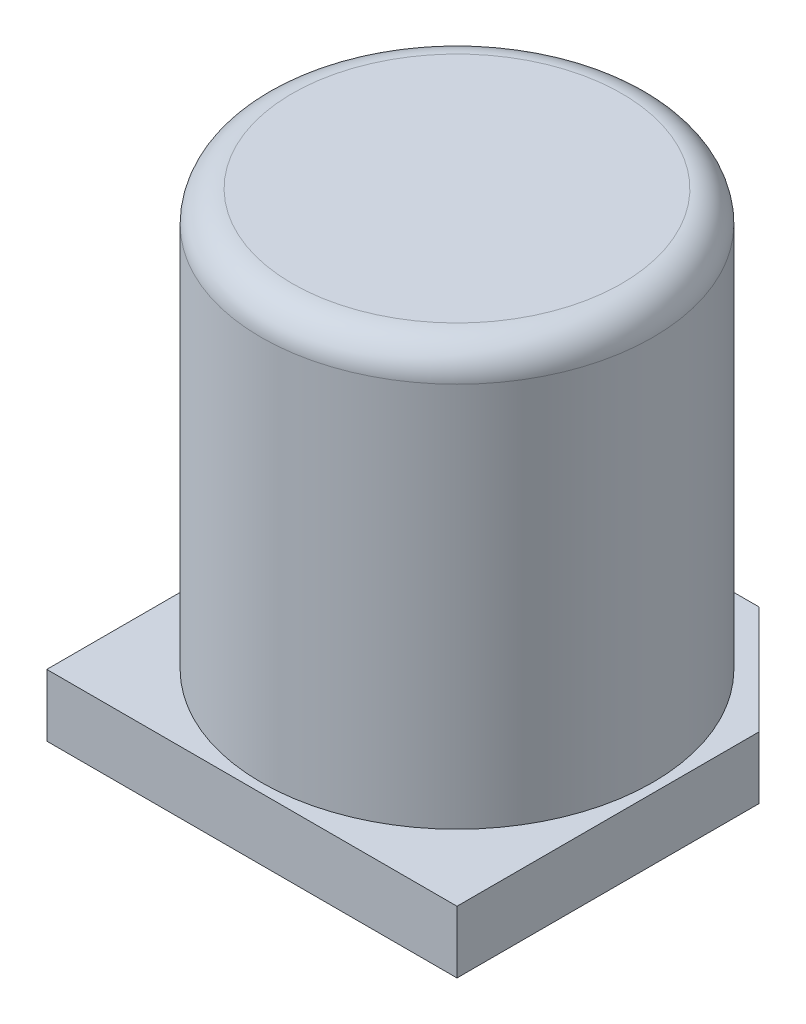
ISO-10303-21;
HEADER;
FILE_DESCRIPTION(('STEP AP214'),'2;1');
FILE_NAME('part.step','',(''),(''),'','','');
FILE_SCHEMA(('AUTOMOTIVE_DESIGN { 1 0 10303 214 1 1 1 1 }'));
ENDSEC;
DATA;
#1=APPLICATION_CONTEXT('core data for automotive mechanical design processes');
#2=APPLICATION_PROTOCOL_DEFINITION('international standard','automotive_design',2000,#1);
#3=PRODUCT_CONTEXT('',#1,'mechanical');
#4=PRODUCT('Part','Part','',(#3));
#5=PRODUCT_RELATED_PRODUCT_CATEGORY('part','',(#4));
#6=PRODUCT_DEFINITION_FORMATION('','',#4);
#7=PRODUCT_DEFINITION_CONTEXT('part definition',#1,'design');
#8=PRODUCT_DEFINITION('design','',#6,#7);
#9=PRODUCT_DEFINITION_SHAPE('','',#8);
#10=(LENGTH_UNIT() NAMED_UNIT(*) SI_UNIT(.MILLI.,.METRE.));
#11=(NAMED_UNIT(*) PLANE_ANGLE_UNIT() SI_UNIT($,.RADIAN.));
#12=(NAMED_UNIT(*) SI_UNIT($,.STERADIAN.) SOLID_ANGLE_UNIT());
#13=UNCERTAINTY_MEASURE_WITH_UNIT(LENGTH_MEASURE(1.E-05),#10,'distance_accuracy_value','');
#14=(GEOMETRIC_REPRESENTATION_CONTEXT(3) GLOBAL_UNCERTAINTY_ASSIGNED_CONTEXT((#13)) GLOBAL_UNIT_ASSIGNED_CONTEXT((#10,
#11,#12)) REPRESENTATION_CONTEXT('',''));
#15=CARTESIAN_POINT('',(0.,0.,0.));
#16=DIRECTION('',(0.,0.,1.));
#17=DIRECTION('',(1.,0.,0.));
#18=AXIS2_PLACEMENT_3D('',#15,#16,#17);
#19=CARTESIAN_POINT('',(-7.40142135623731,1.,0.));
#20=DIRECTION('',(0.,1.,0.));
#21=DIRECTION('',(0.,0.,1.));
#22=AXIS2_PLACEMENT_3D('',#19,#20,#21);
#23=PLANE('',#22);
#24=DIRECTION('',(0.,0.,1.));
#25=VECTOR('',#24,1.);
#26=CARTESIAN_POINT('',(3.3,1.,0.));
#27=LINE('',#26,#25);
#28=CARTESIAN_POINT('',(3.3,1.,-1.56254826892681));
#29=VERTEX_POINT('',#28);
#30=CARTESIAN_POINT('',(3.3,1.,3.3));
#31=VERTEX_POINT('',#30);
#32=EDGE_CURVE('E135',#29,#31,#27,.T.);
#33=ORIENTED_EDGE('',*,*,#32,.F.);
#34=DIRECTION('',(-0.707106781186547,0.,-0.707106781186549));
#35=VECTOR('',#34,1.);
#36=CARTESIAN_POINT('',(-1.26943654365524,1.,-6.13198481258206));
#37=LINE('',#36,#35);
#38=CARTESIAN_POINT('',(1.56254826892681,1.,-3.3));
#39=VERTEX_POINT('',#38);
#40=EDGE_CURVE('E116',#29,#39,#37,.T.);
#41=ORIENTED_EDGE('',*,*,#40,.T.);
#42=DIRECTION('',(1.,0.,0.));
#43=VECTOR('',#42,1.);
#44=CARTESIAN_POINT('',(-7.40142135623731,1.,-3.3));
#45=LINE('',#44,#43);
#46=CARTESIAN_POINT('',(-1.56254826892681,1.,-3.3));
#47=VERTEX_POINT('',#46);
#48=EDGE_CURVE('E114',#47,#39,#45,.T.);
#49=ORIENTED_EDGE('',*,*,#48,.F.);
#50=DIRECTION('',(0.707106781186546,0.,-0.707106781186549));
#51=VECTOR('',#50,1.);
#52=CARTESIAN_POINT('',(-6.13198481258205,1.,1.26943654365525));
#53=LINE('',#52,#51);
#54=CARTESIAN_POINT('',(-3.3,1.,-1.56254826892681));
#55=VERTEX_POINT('',#54);
#56=EDGE_CURVE('E102',#55,#47,#53,.T.);
#57=ORIENTED_EDGE('',*,*,#56,.F.);
#58=DIRECTION('',(0.,0.,1.));
#59=VECTOR('',#58,1.);
#60=CARTESIAN_POINT('',(-3.3,1.,0.));
#61=LINE('',#60,#59);
#62=CARTESIAN_POINT('',(-3.3,1.,3.3));
#63=VERTEX_POINT('',#62);
#64=EDGE_CURVE('E108',#55,#63,#61,.T.);
#65=ORIENTED_EDGE('',*,*,#64,.T.);
#66=DIRECTION('',(1.,0.,0.));
#67=VECTOR('',#66,1.);
#68=CARTESIAN_POINT('',(-7.40142135623731,1.,3.3));
#69=LINE('',#68,#67);
#70=EDGE_CURVE('E53',#63,#31,#69,.T.);
#71=ORIENTED_EDGE('',*,*,#70,.T.);
#72=EDGE_LOOP('',(#33,#41,#49,#57,#65,#71));
#73=FACE_BOUND('',#72,.T.);
#74=CARTESIAN_POINT('',(0.,1.,0.));
#75=DIRECTION('',(0.,1.,0.));
#76=DIRECTION('',(0.,0.,1.));
#77=AXIS2_PLACEMENT_3D('',#74,#75,#76);
#78=CIRCLE('',#77,3.15);
#79=CARTESIAN_POINT('',(0.,1.,3.15));
#80=VERTEX_POINT('',#79);
#81=EDGE_CURVE('E125',#80,#80,#78,.T.);
#82=ORIENTED_EDGE('',*,*,#81,.F.);
#83=EDGE_LOOP('',(#82));
#84=FACE_BOUND('',#83,.T.);
#85=ADVANCED_FACE('F36',(#73,#84),#23,.T.);
#86=CARTESIAN_POINT('',(3.3,1.,0.));
#87=DIRECTION('',(1.,0.,0.));
#88=DIRECTION('',(0.,0.,-1.));
#89=AXIS2_PLACEMENT_3D('',#86,#87,#88);
#90=PLANE('',#89);
#91=DIRECTION('',(0.,0.,1.));
#92=VECTOR('',#91,1.);
#93=CARTESIAN_POINT('',(3.3,0.,0.));
#94=LINE('',#93,#92);
#95=CARTESIAN_POINT('',(3.3,0.,-1.56254826892681));
#96=VERTEX_POINT('',#95);
#97=CARTESIAN_POINT('',(3.3,0.,3.3));
#98=VERTEX_POINT('',#97);
#99=EDGE_CURVE('E121',#96,#98,#94,.T.);
#100=ORIENTED_EDGE('',*,*,#99,.F.);
#101=DIRECTION('',(0.,-1.,0.));
#102=VECTOR('',#101,1.);
#103=CARTESIAN_POINT('',(3.3,1.,-1.56254826892681));
#104=LINE('',#103,#102);
#105=EDGE_CURVE('E87',#29,#96,#104,.T.);
#106=ORIENTED_EDGE('',*,*,#105,.F.);
#107=ORIENTED_EDGE('',*,*,#32,.T.);
#108=DIRECTION('',(0.,-1.,0.));
#109=VECTOR('',#108,1.);
#110=CARTESIAN_POINT('',(3.3,1.,3.3));
#111=LINE('',#110,#109);
#112=EDGE_CURVE('E82',#31,#98,#111,.T.);
#113=ORIENTED_EDGE('',*,*,#112,.T.);
#114=EDGE_LOOP('',(#100,#106,#107,#113));
#115=FACE_BOUND('',#114,.T.);
#116=ADVANCED_FACE('F155',(#115),#90,.T.);
#117=CARTESIAN_POINT('',(-1.26943654365524,1.,-6.13198481258206));
#118=DIRECTION('',(-0.707106781186549,0.,0.707106781186547));
#119=DIRECTION('',(0.707106781186547,0.,0.707106781186549));
#120=AXIS2_PLACEMENT_3D('',#117,#118,#119);
#121=PLANE('',#120);
#122=DIRECTION('',(-0.707106781186547,0.,-0.707106781186549));
#123=VECTOR('',#122,1.);
#124=CARTESIAN_POINT('',(-1.26943654365524,0.,-6.13198481258206));
#125=LINE('',#124,#123);
#126=CARTESIAN_POINT('',(1.56254826892681,0.,-3.3));
#127=VERTEX_POINT('',#126);
#128=EDGE_CURVE('E124',#96,#127,#125,.T.);
#129=ORIENTED_EDGE('',*,*,#128,.T.);
#130=DIRECTION('',(0.,-1.,0.));
#131=VECTOR('',#130,1.);
#132=CARTESIAN_POINT('',(1.56254826892681,1.,-3.3));
#133=LINE('',#132,#131);
#134=EDGE_CURVE('E139',#39,#127,#133,.T.);
#135=ORIENTED_EDGE('',*,*,#134,.F.);
#136=ORIENTED_EDGE('',*,*,#40,.F.);
#137=ORIENTED_EDGE('',*,*,#105,.T.);
#138=EDGE_LOOP('',(#129,#135,#136,#137));
#139=FACE_BOUND('',#138,.T.);
#140=ADVANCED_FACE('F160',(#139),#121,.F.);
#141=CARTESIAN_POINT('',(-7.40142135623731,1.,-3.3));
#142=DIRECTION('',(0.,0.,-1.));
#143=DIRECTION('',(-1.,0.,0.));
#144=AXIS2_PLACEMENT_3D('',#141,#142,#143);
#145=PLANE('',#144);
#146=DIRECTION('',(1.,0.,0.));
#147=VECTOR('',#146,1.);
#148=CARTESIAN_POINT('',(-7.40142135623731,0.,-3.3));
#149=LINE('',#148,#147);
#150=CARTESIAN_POINT('',(-1.56254826892681,0.,-3.3));
#151=VERTEX_POINT('',#150);
#152=EDGE_CURVE('E128',#151,#127,#149,.T.);
#153=ORIENTED_EDGE('',*,*,#152,.F.);
#154=DIRECTION('',(0.,-1.,0.));
#155=VECTOR('',#154,1.);
#156=CARTESIAN_POINT('',(-1.56254826892681,1.,-3.3));
#157=LINE('',#156,#155);
#158=EDGE_CURVE('E105',#47,#151,#157,.T.);
#159=ORIENTED_EDGE('',*,*,#158,.F.);
#160=ORIENTED_EDGE('',*,*,#48,.T.);
#161=ORIENTED_EDGE('',*,*,#134,.T.);
#162=EDGE_LOOP('',(#153,#159,#160,#161));
#163=FACE_BOUND('',#162,.T.);
#164=ADVANCED_FACE('F175',(#163),#145,.T.);
#165=CARTESIAN_POINT('',(-6.13198481258205,1.,1.26943654365525));
#166=DIRECTION('',(-0.707106781186549,0.,-0.707106781186546));
#167=DIRECTION('',(-0.707106781186546,0.,0.707106781186549));
#168=AXIS2_PLACEMENT_3D('',#165,#166,#167);
#169=PLANE('',#168);
#170=DIRECTION('',(0.707106781186546,0.,-0.707106781186549));
#171=VECTOR('',#170,1.);
#172=CARTESIAN_POINT('',(-6.13198481258205,0.,1.26943654365525));
#173=LINE('',#172,#171);
#174=CARTESIAN_POINT('',(-3.3,0.,-1.56254826892681));
#175=VERTEX_POINT('',#174);
#176=EDGE_CURVE('E104',#175,#151,#173,.T.);
#177=ORIENTED_EDGE('',*,*,#176,.F.);
#178=DIRECTION('',(0.,-1.,0.));
#179=VECTOR('',#178,1.);
#180=CARTESIAN_POINT('',(-3.3,1.,-1.56254826892681));
#181=LINE('',#180,#179);
#182=EDGE_CURVE('E98',#55,#175,#181,.T.);
#183=ORIENTED_EDGE('',*,*,#182,.F.);
#184=ORIENTED_EDGE('',*,*,#56,.T.);
#185=ORIENTED_EDGE('',*,*,#158,.T.);
#186=EDGE_LOOP('',(#177,#183,#184,#185));
#187=FACE_BOUND('',#186,.T.);
#188=ADVANCED_FACE('F100',(#187),#169,.T.);
#189=CARTESIAN_POINT('',(-3.3,1.,0.));
#190=DIRECTION('',(1.,0.,0.));
#191=DIRECTION('',(0.,0.,-1.));
#192=AXIS2_PLACEMENT_3D('',#189,#190,#191);
#193=PLANE('',#192);
#194=DIRECTION('',(0.,0.,1.));
#195=VECTOR('',#194,1.);
#196=CARTESIAN_POINT('',(-3.3,0.,0.));
#197=LINE('',#196,#195);
#198=CARTESIAN_POINT('',(-3.3,0.,3.3));
#199=VERTEX_POINT('',#198);
#200=EDGE_CURVE('E75',#175,#199,#197,.T.);
#201=ORIENTED_EDGE('',*,*,#200,.T.);
#202=DIRECTION('',(0.,-1.,0.));
#203=VECTOR('',#202,1.);
#204=CARTESIAN_POINT('',(-3.3,1.,3.3));
#205=LINE('',#204,#203);
#206=EDGE_CURVE('E106',#63,#199,#205,.T.);
#207=ORIENTED_EDGE('',*,*,#206,.F.);
#208=ORIENTED_EDGE('',*,*,#64,.F.);
#209=ORIENTED_EDGE('',*,*,#182,.T.);
#210=EDGE_LOOP('',(#201,#207,#208,#209));
#211=FACE_BOUND('',#210,.T.);
#212=ADVANCED_FACE('F109',(#211),#193,.F.);
#213=CARTESIAN_POINT('',(-7.40142135623731,1.,3.3));
#214=DIRECTION('',(0.,0.,-1.));
#215=DIRECTION('',(-1.,0.,0.));
#216=AXIS2_PLACEMENT_3D('',#213,#214,#215);
#217=PLANE('',#216);
#218=DIRECTION('',(1.,0.,0.));
#219=VECTOR('',#218,1.);
#220=CARTESIAN_POINT('',(-7.40142135623731,0.,3.3));
#221=LINE('',#220,#219);
#222=EDGE_CURVE('E133',#199,#98,#221,.T.);
#223=ORIENTED_EDGE('',*,*,#222,.T.);
#224=ORIENTED_EDGE('',*,*,#112,.F.);
#225=ORIENTED_EDGE('',*,*,#70,.F.);
#226=ORIENTED_EDGE('',*,*,#206,.T.);
#227=EDGE_LOOP('',(#223,#224,#225,#226));
#228=FACE_BOUND('',#227,.T.);
#229=ADVANCED_FACE('F166',(#228),#217,.F.);
#230=CARTESIAN_POINT('',(-7.40142135623731,0.,0.));
#231=DIRECTION('',(0.,1.,0.));
#232=DIRECTION('',(0.,0.,1.));
#233=AXIS2_PLACEMENT_3D('',#230,#231,#232);
#234=PLANE('',#233);
#235=ORIENTED_EDGE('',*,*,#99,.T.);
#236=ORIENTED_EDGE('',*,*,#222,.F.);
#237=ORIENTED_EDGE('',*,*,#200,.F.);
#238=ORIENTED_EDGE('',*,*,#176,.T.);
#239=ORIENTED_EDGE('',*,*,#152,.T.);
#240=ORIENTED_EDGE('',*,*,#128,.F.);
#241=EDGE_LOOP('',(#235,#236,#237,#238,#239,#240));
#242=FACE_BOUND('',#241,.T.);
#243=ADVANCED_FACE('F163',(#242),#234,.F.);
#244=CARTESIAN_POINT('',(0.,7.7,0.));
#245=DIRECTION('',(0.,-1.,0.));
#246=DIRECTION('',(0.,0.,-1.));
#247=AXIS2_PLACEMENT_3D('',#244,#245,#246);
#248=CYLINDRICAL_SURFACE('',#247,3.15);
#249=CARTESIAN_POINT('',(0.,7.2,0.));
#250=DIRECTION('',(0.,1.,0.));
#251=DIRECTION('',(0.,0.,1.));
#252=AXIS2_PLACEMENT_3D('',#249,#250,#251);
#253=CIRCLE('',#252,3.15);
#254=CARTESIAN_POINT('',(0.,7.2,3.15));
#255=VERTEX_POINT('',#254);
#256=EDGE_CURVE('E11',#255,#255,#253,.F.);
#257=ORIENTED_EDGE('',*,*,#256,.T.);
#258=EDGE_LOOP('',(#257));
#259=FACE_BOUND('',#258,.T.);
#260=ORIENTED_EDGE('',*,*,#81,.T.);
#261=EDGE_LOOP('',(#260));
#262=FACE_BOUND('',#261,.T.);
#263=ADVANCED_FACE('F151',(#259,#262),#248,.T.);
#264=CARTESIAN_POINT('',(0.,7.7,0.));
#265=DIRECTION('',(0.,1.,0.));
#266=DIRECTION('',(0.,0.,1.));
#267=AXIS2_PLACEMENT_3D('',#264,#265,#266);
#268=PLANE('',#267);
#269=CARTESIAN_POINT('',(0.,7.7,0.));
#270=DIRECTION('',(0.,1.,0.));
#271=DIRECTION('',(0.,0.,1.));
#272=AXIS2_PLACEMENT_3D('',#269,#270,#271);
#273=CIRCLE('',#272,2.65);
#274=CARTESIAN_POINT('',(0.,7.7,2.65));
#275=VERTEX_POINT('',#274);
#276=EDGE_CURVE('E45',#275,#275,#273,.T.);
#277=ORIENTED_EDGE('',*,*,#276,.T.);
#278=EDGE_LOOP('',(#277));
#279=FACE_BOUND('',#278,.T.);
#280=ADVANCED_FACE('F144',(#279),#268,.T.);
#281=CARTESIAN_POINT('',(0.,7.2,0.));
#282=DIRECTION('',(0.,1.,0.));
#283=DIRECTION('',(0.,0.,1.));
#284=AXIS2_PLACEMENT_3D('',#281,#282,#283);
#285=TOROIDAL_SURFACE('',#284,2.65,0.5);
#286=ORIENTED_EDGE('',*,*,#256,.F.);
#287=EDGE_LOOP('',(#286));
#288=FACE_BOUND('',#287,.T.);
#289=ORIENTED_EDGE('',*,*,#276,.F.);
#290=EDGE_LOOP('',(#289));
#291=FACE_BOUND('',#290,.T.);
#292=ADVANCED_FACE('F38',(#288,#291),#285,.T.);
#293=CLOSED_SHELL('',(#85,#116,#140,#164,#188,#212,#229,#243,#263,#280,#292));
#294=MANIFOLD_SOLID_BREP('B2',#293);
#295=ADVANCED_BREP_SHAPE_REPRESENTATION('',(#18,#294),#14);
#296=SHAPE_DEFINITION_REPRESENTATION(#9,#295);
ENDSEC;
END-ISO-10303-21;
